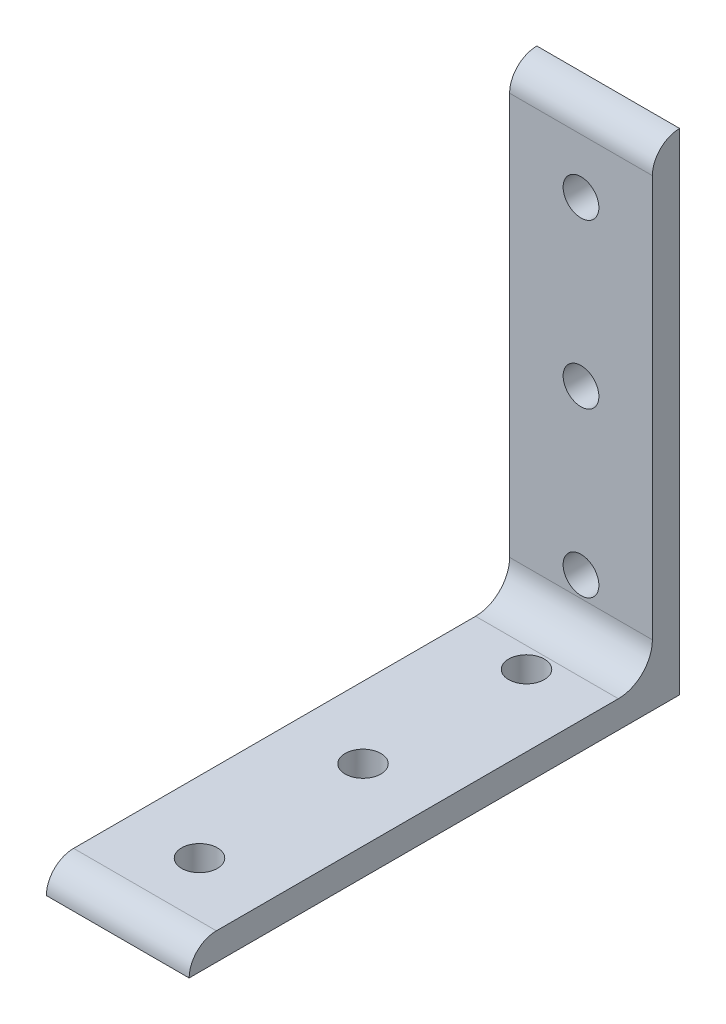
ISO-10303-21;
HEADER;
FILE_DESCRIPTION(('STEP AP214'),'2;1');
FILE_NAME('part.step','',(''),(''),'','','');
FILE_SCHEMA(('AUTOMOTIVE_DESIGN { 1 0 10303 214 1 1 1 1 }'));
ENDSEC;
DATA;
#1=APPLICATION_CONTEXT('core data for automotive mechanical design processes');
#2=APPLICATION_PROTOCOL_DEFINITION('international standard','automotive_design',2000,#1);
#3=PRODUCT_CONTEXT('',#1,'mechanical');
#4=PRODUCT('Part','Part','',(#3));
#5=PRODUCT_RELATED_PRODUCT_CATEGORY('part','',(#4));
#6=PRODUCT_DEFINITION_FORMATION('','',#4);
#7=PRODUCT_DEFINITION_CONTEXT('part definition',#1,'design');
#8=PRODUCT_DEFINITION('design','',#6,#7);
#9=PRODUCT_DEFINITION_SHAPE('','',#8);
#10=(LENGTH_UNIT() NAMED_UNIT(*) SI_UNIT(.MILLI.,.METRE.));
#11=(NAMED_UNIT(*) PLANE_ANGLE_UNIT() SI_UNIT($,.RADIAN.));
#12=(NAMED_UNIT(*) SI_UNIT($,.STERADIAN.) SOLID_ANGLE_UNIT());
#13=UNCERTAINTY_MEASURE_WITH_UNIT(LENGTH_MEASURE(1.E-05),#10,'distance_accuracy_value','');
#14=(GEOMETRIC_REPRESENTATION_CONTEXT(3) GLOBAL_UNCERTAINTY_ASSIGNED_CONTEXT((#13)) GLOBAL_UNIT_ASSIGNED_CONTEXT((#10,
#11,#12)) REPRESENTATION_CONTEXT('',''));
#15=CARTESIAN_POINT('',(0.,0.,0.));
#16=DIRECTION('',(0.,0.,1.));
#17=DIRECTION('',(1.,0.,0.));
#18=AXIS2_PLACEMENT_3D('',#15,#16,#17);
#19=CARTESIAN_POINT('',(16.637,-1.46410661372442E-12,107.949999999998));
#20=DIRECTION('',(-1.,0.,0.));
#21=DIRECTION('',(0.,1.15283985332604E-13,1.));
#22=AXIS2_PLACEMENT_3D('',#19,#20,#21);
#23=CYLINDRICAL_SURFACE('',#22,6.35000000000146);
#24=CARTESIAN_POINT('',(-16.637,-1.46410661372442E-12,107.949999999998));
#25=DIRECTION('',(1.,0.,0.));
#26=DIRECTION('',(0.,1.,2.52886076034245E-13));
#27=AXIS2_PLACEMENT_3D('',#24,#25,#26);
#28=CIRCLE('',#27,6.35000000000146);
#29=CARTESIAN_POINT('',(-16.637,6.35,107.95));
#30=VERTEX_POINT('',#29);
#31=CARTESIAN_POINT('',(-16.637,-7.31792157150776E-13,114.3));
#32=VERTEX_POINT('',#31);
#33=EDGE_CURVE('E77',#30,#32,#28,.T.);
#34=ORIENTED_EDGE('',*,*,#33,.T.);
#35=DIRECTION('',(1.,0.,0.));
#36=VECTOR('',#35,1.);
#37=CARTESIAN_POINT('',(-16.637,-7.3198974659406E-13,114.3));
#38=LINE('',#37,#36);
#39=CARTESIAN_POINT('',(16.637,-3.66026653431121E-13,114.3));
#40=VERTEX_POINT('',#39);
#41=EDGE_CURVE('E91',#40,#32,#38,.F.);
#42=ORIENTED_EDGE('',*,*,#41,.F.);
#43=CARTESIAN_POINT('',(16.637,-1.46410661372442E-12,107.949999999998));
#44=DIRECTION('',(-1.,0.,0.));
#45=DIRECTION('',(0.,1.72925977998906E-13,1.));
#46=AXIS2_PLACEMENT_3D('',#43,#44,#45);
#47=CIRCLE('',#46,6.35000000000146);
#48=CARTESIAN_POINT('',(16.637,6.35,107.95));
#49=VERTEX_POINT('',#48);
#50=EDGE_CURVE('E98',#49,#40,#47,.F.);
#51=ORIENTED_EDGE('',*,*,#50,.F.);
#52=DIRECTION('',(-1.,0.,0.));
#53=VECTOR('',#52,1.);
#54=CARTESIAN_POINT('',(16.637,6.35,107.95));
#55=LINE('',#54,#53);
#56=EDGE_CURVE('E85',#49,#30,#55,.T.);
#57=ORIENTED_EDGE('',*,*,#56,.T.);
#58=EDGE_LOOP('',(#34,#42,#51,#57));
#59=FACE_BOUND('',#58,.T.);
#60=ADVANCED_FACE('F17',(#59),#23,.T.);
#61=CARTESIAN_POINT('',(-16.637,0.,0.));
#62=DIRECTION('',(0.,-1.,0.));
#63=DIRECTION('',(1.,0.,0.));
#64=AXIS2_PLACEMENT_3D('',#61,#62,#63);
#65=PLANE('',#64);
#66=DIRECTION('',(0.,0.,-1.));
#67=VECTOR('',#66,1.);
#68=CARTESIAN_POINT('',(-16.637,0.,114.3));
#69=LINE('',#68,#67);
#70=CARTESIAN_POINT('',(-16.637,0.,0.));
#71=VERTEX_POINT('',#70);
#72=EDGE_CURVE('E74',#32,#71,#69,.T.);
#73=ORIENTED_EDGE('',*,*,#72,.T.);
#74=DIRECTION('',(1.,0.,0.));
#75=VECTOR('',#74,1.);
#76=CARTESIAN_POINT('',(-16.637,0.,0.));
#77=LINE('',#76,#75);
#78=CARTESIAN_POINT('',(16.637,0.,0.));
#79=VERTEX_POINT('',#78);
#80=EDGE_CURVE('E84',#79,#71,#77,.F.);
#81=ORIENTED_EDGE('',*,*,#80,.F.);
#82=DIRECTION('',(0.,0.,1.));
#83=VECTOR('',#82,1.);
#84=CARTESIAN_POINT('',(16.637,0.,0.));
#85=LINE('',#84,#83);
#86=EDGE_CURVE('E97',#40,#79,#85,.F.);
#87=ORIENTED_EDGE('',*,*,#86,.F.);
#88=ORIENTED_EDGE('',*,*,#41,.T.);
#89=EDGE_LOOP('',(#73,#81,#87,#88));
#90=FACE_BOUND('',#89,.T.);
#91=CARTESIAN_POINT('',(0.,0.,57.15));
#92=DIRECTION('',(0.,1.,0.));
#93=DIRECTION('',(0.,0.,-1.));
#94=AXIS2_PLACEMENT_3D('',#91,#92,#93);
#95=CIRCLE('',#94,4.1656);
#96=CARTESIAN_POINT('',(0.,0.,52.9844));
#97=VERTEX_POINT('',#96);
#98=EDGE_CURVE('E117',#97,#97,#95,.T.);
#99=ORIENTED_EDGE('',*,*,#98,.T.);
#100=EDGE_LOOP('',(#99));
#101=FACE_BOUND('',#100,.T.);
#102=CARTESIAN_POINT('',(0.,0.,19.05));
#103=DIRECTION('',(0.,1.,0.));
#104=DIRECTION('',(0.,0.,-1.));
#105=AXIS2_PLACEMENT_3D('',#102,#103,#104);
#106=CIRCLE('',#105,4.1656);
#107=CARTESIAN_POINT('',(0.,0.,14.8844));
#108=VERTEX_POINT('',#107);
#109=EDGE_CURVE('E122',#108,#108,#106,.T.);
#110=ORIENTED_EDGE('',*,*,#109,.T.);
#111=EDGE_LOOP('',(#110));
#112=FACE_BOUND('',#111,.T.);
#113=CARTESIAN_POINT('',(0.,0.,95.25));
#114=DIRECTION('',(0.,1.,0.));
#115=DIRECTION('',(0.,0.,-1.));
#116=AXIS2_PLACEMENT_3D('',#113,#114,#115);
#117=CIRCLE('',#116,4.1656);
#118=CARTESIAN_POINT('',(0.,0.,91.0844));
#119=VERTEX_POINT('',#118);
#120=EDGE_CURVE('E125',#119,#119,#117,.T.);
#121=ORIENTED_EDGE('',*,*,#120,.T.);
#122=EDGE_LOOP('',(#121));
#123=FACE_BOUND('',#122,.T.);
#124=ADVANCED_FACE('F95',(#90,#101,#112,#123),#65,.T.);
#125=CARTESIAN_POINT('',(-16.637,0.,0.));
#126=DIRECTION('',(0.,0.,-1.));
#127=DIRECTION('',(0.,1.,0.));
#128=AXIS2_PLACEMENT_3D('',#125,#126,#127);
#129=PLANE('',#128);
#130=DIRECTION('',(0.,1.,0.));
#131=VECTOR('',#130,1.);
#132=CARTESIAN_POINT('',(-16.637,0.,0.));
#133=LINE('',#132,#131);
#134=CARTESIAN_POINT('',(-16.637,114.3,0.));
#135=VERTEX_POINT('',#134);
#136=EDGE_CURVE('E79',#71,#135,#133,.T.);
#137=ORIENTED_EDGE('',*,*,#136,.T.);
#138=DIRECTION('',(1.,0.,0.));
#139=VECTOR('',#138,1.);
#140=CARTESIAN_POINT('',(-16.637,114.3,0.));
#141=LINE('',#140,#139);
#142=CARTESIAN_POINT('',(16.637,114.3,0.));
#143=VERTEX_POINT('',#142);
#144=EDGE_CURVE('E129',#143,#135,#141,.F.);
#145=ORIENTED_EDGE('',*,*,#144,.F.);
#146=DIRECTION('',(0.,-1.,0.));
#147=VECTOR('',#146,1.);
#148=CARTESIAN_POINT('',(16.637,114.3,0.));
#149=LINE('',#148,#147);
#150=EDGE_CURVE('E134',#79,#143,#149,.F.);
#151=ORIENTED_EDGE('',*,*,#150,.F.);
#152=ORIENTED_EDGE('',*,*,#80,.T.);
#153=EDGE_LOOP('',(#137,#145,#151,#152));
#154=FACE_BOUND('',#153,.T.);
#155=CARTESIAN_POINT('',(0.,57.15,0.));
#156=DIRECTION('',(0.,0.,1.));
#157=DIRECTION('',(-0.99999999999999,-1.42053920853019E-07,0.));
#158=AXIS2_PLACEMENT_3D('',#155,#156,#157);
#159=CIRCLE('',#158,4.1656);
#160=CARTESIAN_POINT('',(-4.16559999999996,57.1499994082602,0.));
#161=VERTEX_POINT('',#160);
#162=EDGE_CURVE('E138',#161,#161,#159,.T.);
#163=ORIENTED_EDGE('',*,*,#162,.T.);
#164=EDGE_LOOP('',(#163));
#165=FACE_BOUND('',#164,.T.);
#166=CARTESIAN_POINT('',(0.,19.05,0.));
#167=DIRECTION('',(0.,0.,1.));
#168=DIRECTION('',(-1.,0.,0.));
#169=AXIS2_PLACEMENT_3D('',#166,#167,#168);
#170=CIRCLE('',#169,4.1656);
#171=CARTESIAN_POINT('',(-4.1656,19.05,0.));
#172=VERTEX_POINT('',#171);
#173=EDGE_CURVE('E143',#172,#172,#170,.T.);
#174=ORIENTED_EDGE('',*,*,#173,.T.);
#175=EDGE_LOOP('',(#174));
#176=FACE_BOUND('',#175,.T.);
#177=CARTESIAN_POINT('',(0.,95.25,0.));
#178=DIRECTION('',(0.,0.,1.));
#179=DIRECTION('',(-0.99999999999999,-1.42053898678409E-07,0.));
#180=AXIS2_PLACEMENT_3D('',#177,#178,#179);
#181=CIRCLE('',#180,4.1656);
#182=CARTESIAN_POINT('',(-4.16559999999996,95.2499994082603,0.));
#183=VERTEX_POINT('',#182);
#184=EDGE_CURVE('E146',#183,#183,#181,.T.);
#185=ORIENTED_EDGE('',*,*,#184,.T.);
#186=EDGE_LOOP('',(#185));
#187=FACE_BOUND('',#186,.T.);
#188=ADVANCED_FACE('F228',(#154,#165,#176,#187),#129,.T.);
#189=CARTESIAN_POINT('',(16.637,107.949999999998,-1.46454029459342E-12));
#190=DIRECTION('',(-1.,0.,0.));
#191=DIRECTION('',(0.,0.,1.));
#192=AXIS2_PLACEMENT_3D('',#189,#190,#191);
#193=CYLINDRICAL_SURFACE('',#192,6.35000000000147);
#194=CARTESIAN_POINT('',(-16.637,107.949999999998,-1.46454029459342E-12));
#195=DIRECTION('',(1.,0.,0.));
#196=DIRECTION('',(0.,1.,2.3098762146199E-13));
#197=AXIS2_PLACEMENT_3D('',#194,#195,#196);
#198=CIRCLE('',#197,6.35000000000147);
#199=CARTESIAN_POINT('',(-16.637,107.949999999999,6.35));
#200=VERTEX_POINT('',#199);
#201=EDGE_CURVE('E149',#135,#200,#198,.T.);
#202=ORIENTED_EDGE('',*,*,#201,.T.);
#203=DIRECTION('',(1.,0.,0.));
#204=VECTOR('',#203,1.);
#205=CARTESIAN_POINT('',(-16.637,107.949999999999,6.35));
#206=LINE('',#205,#204);
#207=CARTESIAN_POINT('',(16.637,107.949999999999,6.35));
#208=VERTEX_POINT('',#207);
#209=EDGE_CURVE('E152',#208,#200,#206,.F.);
#210=ORIENTED_EDGE('',*,*,#209,.F.);
#211=CARTESIAN_POINT('',(16.637,107.949999999998,-1.46454029459342E-12));
#212=DIRECTION('',(-1.,0.,0.));
#213=DIRECTION('',(0.,1.25324073078918E-13,1.));
#214=AXIS2_PLACEMENT_3D('',#211,#212,#213);
#215=CIRCLE('',#214,6.35000000000147);
#216=EDGE_CURVE('E157',#143,#208,#215,.F.);
#217=ORIENTED_EDGE('',*,*,#216,.F.);
#218=ORIENTED_EDGE('',*,*,#144,.T.);
#219=EDGE_LOOP('',(#202,#210,#217,#218));
#220=FACE_BOUND('',#219,.T.);
#221=ADVANCED_FACE('F235',(#220),#193,.T.);
#222=CARTESIAN_POINT('',(16.637,14.2748,6.35));
#223=DIRECTION('',(0.,0.,1.));
#224=DIRECTION('',(0.,1.,0.));
#225=AXIS2_PLACEMENT_3D('',#222,#223,#224);
#226=PLANE('',#225);
#227=DIRECTION('',(0.,-1.,0.));
#228=VECTOR('',#227,1.);
#229=CARTESIAN_POINT('',(-16.637,107.949999999999,6.35));
#230=LINE('',#229,#228);
#231=CARTESIAN_POINT('',(-16.637,14.2748,6.35));
#232=VERTEX_POINT('',#231);
#233=EDGE_CURVE('E161',#200,#232,#230,.T.);
#234=ORIENTED_EDGE('',*,*,#233,.T.);
#235=DIRECTION('',(1.,0.,0.));
#236=VECTOR('',#235,1.);
#237=CARTESIAN_POINT('',(-16.637,14.2748,6.35));
#238=LINE('',#237,#236);
#239=CARTESIAN_POINT('',(16.637,14.2748,6.35));
#240=VERTEX_POINT('',#239);
#241=EDGE_CURVE('E166',#240,#232,#238,.F.);
#242=ORIENTED_EDGE('',*,*,#241,.F.);
#243=DIRECTION('',(0.,1.,0.));
#244=VECTOR('',#243,1.);
#245=CARTESIAN_POINT('',(16.637,14.2748,6.35));
#246=LINE('',#245,#244);
#247=EDGE_CURVE('E171',#208,#240,#246,.F.);
#248=ORIENTED_EDGE('',*,*,#247,.F.);
#249=ORIENTED_EDGE('',*,*,#209,.T.);
#250=EDGE_LOOP('',(#234,#242,#248,#249));
#251=FACE_BOUND('',#250,.T.);
#252=CARTESIAN_POINT('',(0.,57.15,6.35));
#253=DIRECTION('',(0.,0.,-1.));
#254=DIRECTION('',(1.,0.,0.));
#255=AXIS2_PLACEMENT_3D('',#252,#253,#254);
#256=CIRCLE('',#255,4.1656);
#257=CARTESIAN_POINT('',(4.1656,57.15,6.35));
#258=VERTEX_POINT('',#257);
#259=EDGE_CURVE('E175',#258,#258,#256,.F.);
#260=ORIENTED_EDGE('',*,*,#259,.F.);
#261=EDGE_LOOP('',(#260));
#262=FACE_BOUND('',#261,.T.);
#263=CARTESIAN_POINT('',(0.,19.05,6.35));
#264=DIRECTION('',(0.,0.,-1.));
#265=DIRECTION('',(1.,0.,0.));
#266=AXIS2_PLACEMENT_3D('',#263,#264,#265);
#267=CIRCLE('',#266,4.1656);
#268=CARTESIAN_POINT('',(4.1656,19.05,6.35));
#269=VERTEX_POINT('',#268);
#270=EDGE_CURVE('E180',#269,#269,#267,.F.);
#271=ORIENTED_EDGE('',*,*,#270,.F.);
#272=EDGE_LOOP('',(#271));
#273=FACE_BOUND('',#272,.T.);
#274=CARTESIAN_POINT('',(0.,95.25,6.35));
#275=DIRECTION('',(0.,0.,-1.));
#276=DIRECTION('',(1.,0.,0.));
#277=AXIS2_PLACEMENT_3D('',#274,#275,#276);
#278=CIRCLE('',#277,4.1656);
#279=CARTESIAN_POINT('',(4.1656,95.25,6.35));
#280=VERTEX_POINT('',#279);
#281=EDGE_CURVE('E183',#280,#280,#278,.F.);
#282=ORIENTED_EDGE('',*,*,#281,.F.);
#283=EDGE_LOOP('',(#282));
#284=FACE_BOUND('',#283,.T.);
#285=ADVANCED_FACE('F242',(#251,#262,#273,#284),#226,.T.);
#286=CARTESIAN_POINT('',(16.637,14.2748000000002,14.2748000000002));
#287=DIRECTION('',(-1.,0.,0.));
#288=DIRECTION('',(0.,0.,-1.));
#289=AXIS2_PLACEMENT_3D('',#286,#287,#288);
#290=CYLINDRICAL_SURFACE('',#289,7.92480000000024);
#291=CARTESIAN_POINT('',(-16.637,14.2748000000002,14.2748000000002));
#292=DIRECTION('',(-1.,0.,0.));
#293=DIRECTION('',(0.,0.,-1.));
#294=AXIS2_PLACEMENT_3D('',#291,#292,#293);
#295=CIRCLE('',#294,7.92480000000024);
#296=CARTESIAN_POINT('',(-16.637,6.35,14.2748));
#297=VERTEX_POINT('',#296);
#298=EDGE_CURVE('E186',#297,#232,#295,.F.);
#299=ORIENTED_EDGE('',*,*,#298,.F.);
#300=DIRECTION('',(1.,0.,0.));
#301=VECTOR('',#300,1.);
#302=CARTESIAN_POINT('',(-16.637,6.35,14.2748));
#303=LINE('',#302,#301);
#304=CARTESIAN_POINT('',(16.637,6.35,14.2748));
#305=VERTEX_POINT('',#304);
#306=EDGE_CURVE('E188',#305,#297,#303,.F.);
#307=ORIENTED_EDGE('',*,*,#306,.F.);
#308=CARTESIAN_POINT('',(16.637,14.2748000000002,14.2748000000002));
#309=DIRECTION('',(1.,0.,0.));
#310=DIRECTION('',(0.,-1.,0.));
#311=AXIS2_PLACEMENT_3D('',#308,#309,#310);
#312=CIRCLE('',#311,7.92480000000024);
#313=EDGE_CURVE('E32',#305,#240,#312,.T.);
#314=ORIENTED_EDGE('',*,*,#313,.T.);
#315=ORIENTED_EDGE('',*,*,#241,.T.);
#316=EDGE_LOOP('',(#299,#307,#314,#315));
#317=FACE_BOUND('',#316,.T.);
#318=ADVANCED_FACE('F217',(#317),#290,.F.);
#319=CARTESIAN_POINT('',(-16.637,6.35,107.95));
#320=DIRECTION('',(0.,1.,0.));
#321=DIRECTION('',(1.,0.,0.));
#322=AXIS2_PLACEMENT_3D('',#319,#320,#321);
#323=PLANE('',#322);
#324=DIRECTION('',(0.,0.,1.));
#325=VECTOR('',#324,1.);
#326=CARTESIAN_POINT('',(-16.637,6.35,14.2748));
#327=LINE('',#326,#325);
#328=EDGE_CURVE('E40',#297,#30,#327,.T.);
#329=ORIENTED_EDGE('',*,*,#328,.T.);
#330=ORIENTED_EDGE('',*,*,#56,.F.);
#331=DIRECTION('',(0.,0.,-1.));
#332=VECTOR('',#331,1.);
#333=CARTESIAN_POINT('',(16.637,6.35,107.95));
#334=LINE('',#333,#332);
#335=EDGE_CURVE('E199',#305,#49,#334,.F.);
#336=ORIENTED_EDGE('',*,*,#335,.F.);
#337=ORIENTED_EDGE('',*,*,#306,.T.);
#338=EDGE_LOOP('',(#329,#330,#336,#337));
#339=FACE_BOUND('',#338,.T.);
#340=CARTESIAN_POINT('',(0.,6.35,57.15));
#341=DIRECTION('',(0.,-1.,0.));
#342=DIRECTION('',(0.,0.,1.));
#343=AXIS2_PLACEMENT_3D('',#340,#341,#342);
#344=CIRCLE('',#343,4.1656);
#345=CARTESIAN_POINT('',(0.,6.35,61.3156));
#346=VERTEX_POINT('',#345);
#347=EDGE_CURVE('E203',#346,#346,#344,.F.);
#348=ORIENTED_EDGE('',*,*,#347,.F.);
#349=EDGE_LOOP('',(#348));
#350=FACE_BOUND('',#349,.T.);
#351=CARTESIAN_POINT('',(0.,6.35,19.05));
#352=DIRECTION('',(0.,-1.,0.));
#353=DIRECTION('',(0.,0.,1.));
#354=AXIS2_PLACEMENT_3D('',#351,#352,#353);
#355=CIRCLE('',#354,4.1656);
#356=CARTESIAN_POINT('',(0.,6.35,23.2156));
#357=VERTEX_POINT('',#356);
#358=EDGE_CURVE('E25',#357,#357,#355,.F.);
#359=ORIENTED_EDGE('',*,*,#358,.F.);
#360=EDGE_LOOP('',(#359));
#361=FACE_BOUND('',#360,.T.);
#362=CARTESIAN_POINT('',(0.,6.35,95.25));
#363=DIRECTION('',(0.,-1.,0.));
#364=DIRECTION('',(0.,0.,1.));
#365=AXIS2_PLACEMENT_3D('',#362,#363,#364);
#366=CIRCLE('',#365,4.1656);
#367=CARTESIAN_POINT('',(0.,6.35,99.4156));
#368=VERTEX_POINT('',#367);
#369=EDGE_CURVE('E11',#368,#368,#366,.F.);
#370=ORIENTED_EDGE('',*,*,#369,.F.);
#371=EDGE_LOOP('',(#370));
#372=FACE_BOUND('',#371,.T.);
#373=ADVANCED_FACE('F213',(#339,#350,#361,#372),#323,.T.);
#374=CARTESIAN_POINT('',(16.637,-7.32053306862212E-13,114.3));
#375=DIRECTION('',(1.,0.,0.));
#376=DIRECTION('',(0.,0.,-1.));
#377=AXIS2_PLACEMENT_3D('',#374,#375,#376);
#378=PLANE('',#377);
#379=ORIENTED_EDGE('',*,*,#50,.T.);
#380=ORIENTED_EDGE('',*,*,#86,.T.);
#381=ORIENTED_EDGE('',*,*,#150,.T.);
#382=ORIENTED_EDGE('',*,*,#216,.T.);
#383=ORIENTED_EDGE('',*,*,#247,.T.);
#384=ORIENTED_EDGE('',*,*,#313,.F.);
#385=ORIENTED_EDGE('',*,*,#335,.T.);
#386=EDGE_LOOP('',(#379,#380,#381,#382,#383,#384,#385));
#387=FACE_BOUND('',#386,.T.);
#388=ADVANCED_FACE('F216',(#387),#378,.T.);
#389=CARTESIAN_POINT('',(-16.637,-7.31989746594052E-13,114.3));
#390=DIRECTION('',(-1.,0.,0.));
#391=DIRECTION('',(0.,1.,0.));
#392=AXIS2_PLACEMENT_3D('',#389,#390,#391);
#393=PLANE('',#392);
#394=ORIENTED_EDGE('',*,*,#33,.F.);
#395=ORIENTED_EDGE('',*,*,#328,.F.);
#396=ORIENTED_EDGE('',*,*,#298,.T.);
#397=ORIENTED_EDGE('',*,*,#233,.F.);
#398=ORIENTED_EDGE('',*,*,#201,.F.);
#399=ORIENTED_EDGE('',*,*,#136,.F.);
#400=ORIENTED_EDGE('',*,*,#72,.F.);
#401=EDGE_LOOP('',(#394,#395,#396,#397,#398,#399,#400));
#402=FACE_BOUND('',#401,.T.);
#403=ADVANCED_FACE('F76',(#402),#393,.T.);
#404=CARTESIAN_POINT('',(0.,19.05,6.35));
#405=DIRECTION('',(0.,0.,-1.));
#406=DIRECTION('',(1.,0.,0.));
#407=AXIS2_PLACEMENT_3D('',#404,#405,#406);
#408=CYLINDRICAL_SURFACE('',#407,4.1656);
#409=ORIENTED_EDGE('',*,*,#270,.T.);
#410=EDGE_LOOP('',(#409));
#411=FACE_BOUND('',#410,.T.);
#412=ORIENTED_EDGE('',*,*,#173,.F.);
#413=EDGE_LOOP('',(#412));
#414=FACE_BOUND('',#413,.T.);
#415=ADVANCED_FACE('F254',(#411,#414),#408,.F.);
#416=CARTESIAN_POINT('',(0.,57.15,6.35));
#417=DIRECTION('',(0.,0.,-1.));
#418=DIRECTION('',(1.,0.,0.));
#419=AXIS2_PLACEMENT_3D('',#416,#417,#418);
#420=CYLINDRICAL_SURFACE('',#419,4.1656);
#421=ORIENTED_EDGE('',*,*,#259,.T.);
#422=EDGE_LOOP('',(#421));
#423=FACE_BOUND('',#422,.T.);
#424=ORIENTED_EDGE('',*,*,#162,.F.);
#425=EDGE_LOOP('',(#424));
#426=FACE_BOUND('',#425,.T.);
#427=ADVANCED_FACE('F257',(#423,#426),#420,.F.);
#428=CARTESIAN_POINT('',(0.,6.35,19.05));
#429=DIRECTION('',(0.,-1.,0.));
#430=DIRECTION('',(0.,0.,1.));
#431=AXIS2_PLACEMENT_3D('',#428,#429,#430);
#432=CYLINDRICAL_SURFACE('',#431,4.1656);
#433=ORIENTED_EDGE('',*,*,#358,.T.);
#434=EDGE_LOOP('',(#433));
#435=FACE_BOUND('',#434,.T.);
#436=ORIENTED_EDGE('',*,*,#109,.F.);
#437=EDGE_LOOP('',(#436));
#438=FACE_BOUND('',#437,.T.);
#439=ADVANCED_FACE('F210',(#435,#438),#432,.F.);
#440=CARTESIAN_POINT('',(0.,6.35,57.15));
#441=DIRECTION('',(0.,-1.,0.));
#442=DIRECTION('',(0.,0.,1.));
#443=AXIS2_PLACEMENT_3D('',#440,#441,#442);
#444=CYLINDRICAL_SURFACE('',#443,4.1656);
#445=ORIENTED_EDGE('',*,*,#347,.T.);
#446=EDGE_LOOP('',(#445));
#447=FACE_BOUND('',#446,.T.);
#448=ORIENTED_EDGE('',*,*,#98,.F.);
#449=EDGE_LOOP('',(#448));
#450=FACE_BOUND('',#449,.T.);
#451=ADVANCED_FACE('F264',(#447,#450),#444,.F.);
#452=CARTESIAN_POINT('',(0.,95.25,6.35));
#453=DIRECTION('',(0.,0.,-1.));
#454=DIRECTION('',(1.,0.,0.));
#455=AXIS2_PLACEMENT_3D('',#452,#453,#454);
#456=CYLINDRICAL_SURFACE('',#455,4.1656);
#457=ORIENTED_EDGE('',*,*,#281,.T.);
#458=EDGE_LOOP('',(#457));
#459=FACE_BOUND('',#458,.T.);
#460=ORIENTED_EDGE('',*,*,#184,.F.);
#461=EDGE_LOOP('',(#460));
#462=FACE_BOUND('',#461,.T.);
#463=ADVANCED_FACE('F224',(#459,#462),#456,.F.);
#464=CARTESIAN_POINT('',(0.,6.35,95.25));
#465=DIRECTION('',(0.,-1.,0.));
#466=DIRECTION('',(1.42054118812747E-07,0.,0.99999999999999));
#467=AXIS2_PLACEMENT_3D('',#464,#465,#466);
#468=CYLINDRICAL_SURFACE('',#467,4.1656);
#469=ORIENTED_EDGE('',*,*,#369,.T.);
#470=EDGE_LOOP('',(#469));
#471=FACE_BOUND('',#470,.T.);
#472=ORIENTED_EDGE('',*,*,#120,.F.);
#473=EDGE_LOOP('',(#472));
#474=FACE_BOUND('',#473,.T.);
#475=ADVANCED_FACE('F19',(#471,#474),#468,.F.);
#476=CLOSED_SHELL('',(#60,#124,#188,#221,#285,#318,#373,#388,#403,#415,#427,#439,#451,#463,#475));
#477=MANIFOLD_SOLID_BREP('B1',#476);
#478=ADVANCED_BREP_SHAPE_REPRESENTATION('',(#18,#477),#14);
#479=SHAPE_DEFINITION_REPRESENTATION(#9,#478);
ENDSEC;
END-ISO-10303-21;
